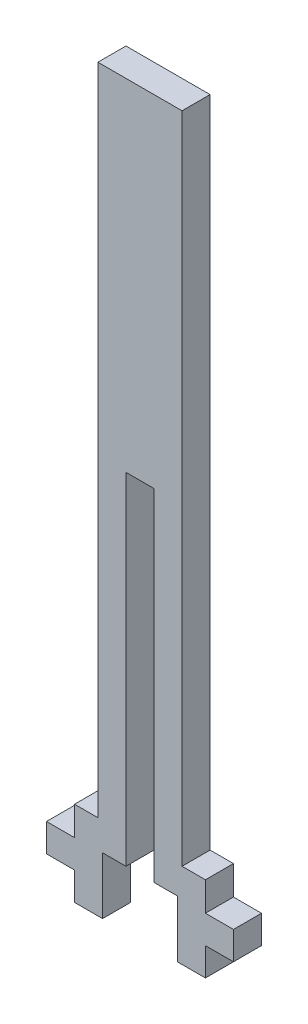
ISO-10303-21;
HEADER;
FILE_DESCRIPTION(('STEP AP214'),'2;1');
FILE_NAME('part.step','',(''),(''),'','','');
FILE_SCHEMA(('AUTOMOTIVE_DESIGN { 1 0 10303 214 1 1 1 1 }'));
ENDSEC;
DATA;
#1=APPLICATION_CONTEXT('core data for automotive mechanical design processes');
#2=APPLICATION_PROTOCOL_DEFINITION('international standard','automotive_design',2000,#1);
#3=PRODUCT_CONTEXT('',#1,'mechanical');
#4=PRODUCT('Part','Part','',(#3));
#5=PRODUCT_RELATED_PRODUCT_CATEGORY('part','',(#4));
#6=PRODUCT_DEFINITION_FORMATION('','',#4);
#7=PRODUCT_DEFINITION_CONTEXT('part definition',#1,'design');
#8=PRODUCT_DEFINITION('design','',#6,#7);
#9=PRODUCT_DEFINITION_SHAPE('','',#8);
#10=(LENGTH_UNIT() NAMED_UNIT(*) SI_UNIT(.MILLI.,.METRE.));
#11=(NAMED_UNIT(*) PLANE_ANGLE_UNIT() SI_UNIT($,.RADIAN.));
#12=(NAMED_UNIT(*) SI_UNIT($,.STERADIAN.) SOLID_ANGLE_UNIT());
#13=UNCERTAINTY_MEASURE_WITH_UNIT(LENGTH_MEASURE(1.E-05),#10,'distance_accuracy_value','');
#14=(GEOMETRIC_REPRESENTATION_CONTEXT(3) GLOBAL_UNCERTAINTY_ASSIGNED_CONTEXT((#13)) GLOBAL_UNIT_ASSIGNED_CONTEXT((#10,
#11,#12)) REPRESENTATION_CONTEXT('',''));
#15=CARTESIAN_POINT('',(0.,0.,0.));
#16=DIRECTION('',(0.,0.,1.));
#17=DIRECTION('',(1.,0.,0.));
#18=AXIS2_PLACEMENT_3D('',#15,#16,#17);
#19=CARTESIAN_POINT('',(7.,0.,3.));
#20=DIRECTION('',(-1.,0.,0.));
#21=DIRECTION('',(0.,0.,1.));
#22=AXIS2_PLACEMENT_3D('',#19,#20,#21);
#23=PLANE('',#22);
#24=DIRECTION('',(0.,0.,1.));
#25=VECTOR('',#24,1.);
#26=CARTESIAN_POINT('',(7.,-33.543999941,0.));
#27=LINE('',#26,#25);
#28=CARTESIAN_POINT('',(7.,-33.543999941,0.));
#29=VERTEX_POINT('',#28);
#30=CARTESIAN_POINT('',(7.,-33.543999941,3.));
#31=VERTEX_POINT('',#30);
#32=EDGE_CURVE('E211',#29,#31,#27,.T.);
#33=ORIENTED_EDGE('',*,*,#32,.F.);
#34=DIRECTION('',(0.,1.,0.));
#35=VECTOR('',#34,1.);
#36=CARTESIAN_POINT('',(7.,0.,0.));
#37=LINE('',#36,#35);
#38=CARTESIAN_POINT('',(7.,-30.443999941,0.));
#39=VERTEX_POINT('',#38);
#40=EDGE_CURVE('E306',#29,#39,#37,.T.);
#41=ORIENTED_EDGE('',*,*,#40,.T.);
#42=DIRECTION('',(0.,0.,-1.));
#43=VECTOR('',#42,1.);
#44=CARTESIAN_POINT('',(7.,-30.443999941,3.));
#45=LINE('',#44,#43);
#46=CARTESIAN_POINT('',(7.,-30.443999941,3.));
#47=VERTEX_POINT('',#46);
#48=EDGE_CURVE('E235',#47,#39,#45,.T.);
#49=ORIENTED_EDGE('',*,*,#48,.F.);
#50=DIRECTION('',(0.,1.,0.));
#51=VECTOR('',#50,1.);
#52=CARTESIAN_POINT('',(7.,0.,3.));
#53=LINE('',#52,#51);
#54=EDGE_CURVE('E227',#31,#47,#53,.T.);
#55=ORIENTED_EDGE('',*,*,#54,.F.);
#56=EDGE_LOOP('',(#33,#41,#49,#55));
#57=FACE_BOUND('',#56,.T.);
#58=ADVANCED_FACE('F50',(#57),#23,.F.);
#59=CARTESIAN_POINT('',(-7.,0.,3.));
#60=DIRECTION('',(1.,0.,0.));
#61=DIRECTION('',(0.,0.,-1.));
#62=AXIS2_PLACEMENT_3D('',#59,#60,#61);
#63=PLANE('',#62);
#64=DIRECTION('',(0.,0.,1.));
#65=VECTOR('',#64,1.);
#66=CARTESIAN_POINT('',(-7.,-36.543999941,0.));
#67=LINE('',#66,#65);
#68=CARTESIAN_POINT('',(-7.,-36.543999941,0.));
#69=VERTEX_POINT('',#68);
#70=CARTESIAN_POINT('',(-7.,-36.543999941,3.));
#71=VERTEX_POINT('',#70);
#72=EDGE_CURVE('E420',#69,#71,#67,.T.);
#73=ORIENTED_EDGE('',*,*,#72,.F.);
#74=DIRECTION('',(0.,-1.,0.));
#75=VECTOR('',#74,1.);
#76=CARTESIAN_POINT('',(-7.,0.,0.));
#77=LINE('',#76,#75);
#78=CARTESIAN_POINT('',(-7.,-39.543999941,0.));
#79=VERTEX_POINT('',#78);
#80=EDGE_CURVE('E283',#69,#79,#77,.T.);
#81=ORIENTED_EDGE('',*,*,#80,.T.);
#82=DIRECTION('',(0.,0.,-1.));
#83=VECTOR('',#82,1.);
#84=CARTESIAN_POINT('',(-7.,-39.543999941,3.));
#85=LINE('',#84,#83);
#86=CARTESIAN_POINT('',(-7.,-39.543999941,3.));
#87=VERTEX_POINT('',#86);
#88=EDGE_CURVE('E346',#87,#79,#85,.T.);
#89=ORIENTED_EDGE('',*,*,#88,.F.);
#90=DIRECTION('',(0.,-1.,0.));
#91=VECTOR('',#90,1.);
#92=CARTESIAN_POINT('',(-7.,0.,3.));
#93=LINE('',#92,#91);
#94=EDGE_CURVE('E877',#71,#87,#93,.T.);
#95=ORIENTED_EDGE('',*,*,#94,.F.);
#96=EDGE_LOOP('',(#73,#81,#89,#95));
#97=FACE_BOUND('',#96,.T.);
#98=ADVANCED_FACE('F544',(#97),#63,.F.);
#99=CARTESIAN_POINT('',(0.,-33.443999941,3.));
#100=DIRECTION('',(0.,1.,0.));
#101=DIRECTION('',(-1.,0.,0.));
#102=AXIS2_PLACEMENT_3D('',#99,#100,#101);
#103=PLANE('',#102);
#104=DIRECTION('',(1.,0.,0.));
#105=VECTOR('',#104,1.);
#106=CARTESIAN_POINT('',(0.,-33.443999941,3.));
#107=LINE('',#106,#105);
#108=CARTESIAN_POINT('',(1.5,-33.443999941,3.));
#109=VERTEX_POINT('',#108);
#110=CARTESIAN_POINT('',(4.,-33.443999941,3.));
#111=VERTEX_POINT('',#110);
#112=EDGE_CURVE('E500',#109,#111,#107,.T.);
#113=ORIENTED_EDGE('',*,*,#112,.F.);
#114=DIRECTION('',(0.,0.,-1.));
#115=VECTOR('',#114,1.);
#116=CARTESIAN_POINT('',(1.5,-33.443999941,39.6171002633156));
#117=LINE('',#116,#115);
#118=CARTESIAN_POINT('',(1.5,-33.443999941,0.));
#119=VERTEX_POINT('',#118);
#120=EDGE_CURVE('E396',#109,#119,#117,.T.);
#121=ORIENTED_EDGE('',*,*,#120,.T.);
#122=DIRECTION('',(1.,0.,0.));
#123=VECTOR('',#122,1.);
#124=CARTESIAN_POINT('',(0.,-33.443999941,0.));
#125=LINE('',#124,#123);
#126=CARTESIAN_POINT('',(4.,-33.443999941,0.));
#127=VERTEX_POINT('',#126);
#128=EDGE_CURVE('E294',#119,#127,#125,.T.);
#129=ORIENTED_EDGE('',*,*,#128,.T.);
#130=DIRECTION('',(0.,0.,-1.));
#131=VECTOR('',#130,1.);
#132=CARTESIAN_POINT('',(4.,-33.443999941,3.));
#133=LINE('',#132,#131);
#134=EDGE_CURVE('E334',#111,#127,#133,.T.);
#135=ORIENTED_EDGE('',*,*,#134,.F.);
#136=EDGE_LOOP('',(#113,#121,#129,#135));
#137=FACE_BOUND('',#136,.T.);
#138=ADVANCED_FACE('F521',(#137),#103,.F.);
#139=CARTESIAN_POINT('',(0.,39.543999941,3.));
#140=DIRECTION('',(0.,1.,0.));
#141=DIRECTION('',(0.,0.,1.));
#142=AXIS2_PLACEMENT_3D('',#139,#140,#141);
#143=PLANE('',#142);
#144=DIRECTION('',(1.,0.,0.));
#145=VECTOR('',#144,1.);
#146=CARTESIAN_POINT('',(0.,39.543999941,0.));
#147=LINE('',#146,#145);
#148=CARTESIAN_POINT('',(-4.5,39.543999941,0.));
#149=VERTEX_POINT('',#148);
#150=CARTESIAN_POINT('',(4.5,39.543999941,0.));
#151=VERTEX_POINT('',#150);
#152=EDGE_CURVE('E271',#149,#151,#147,.T.);
#153=ORIENTED_EDGE('',*,*,#152,.F.);
#154=DIRECTION('',(0.,0.,-1.));
#155=VECTOR('',#154,1.);
#156=CARTESIAN_POINT('',(-4.5,39.543999941,3.));
#157=LINE('',#156,#155);
#158=CARTESIAN_POINT('',(-4.5,39.543999941,3.));
#159=VERTEX_POINT('',#158);
#160=EDGE_CURVE('E12',#159,#149,#157,.T.);
#161=ORIENTED_EDGE('',*,*,#160,.F.);
#162=DIRECTION('',(1.,0.,0.));
#163=VECTOR('',#162,1.);
#164=CARTESIAN_POINT('',(0.,39.543999941,3.));
#165=LINE('',#164,#163);
#166=CARTESIAN_POINT('',(4.5,39.543999941,3.));
#167=VERTEX_POINT('',#166);
#168=EDGE_CURVE('E319',#159,#167,#165,.T.);
#169=ORIENTED_EDGE('',*,*,#168,.T.);
#170=DIRECTION('',(0.,0.,-1.));
#171=VECTOR('',#170,1.);
#172=CARTESIAN_POINT('',(4.5,39.543999941,3.));
#173=LINE('',#172,#171);
#174=EDGE_CURVE('E270',#167,#151,#173,.T.);
#175=ORIENTED_EDGE('',*,*,#174,.T.);
#176=EDGE_LOOP('',(#153,#161,#169,#175));
#177=FACE_BOUND('',#176,.T.);
#178=ADVANCED_FACE('F52',(#177),#143,.T.);
#179=CARTESIAN_POINT('',(-4.5,0.,3.));
#180=DIRECTION('',(-1.,0.,0.));
#181=DIRECTION('',(0.,0.,1.));
#182=AXIS2_PLACEMENT_3D('',#179,#180,#181);
#183=PLANE('',#182);
#184=DIRECTION('',(0.,1.,0.));
#185=VECTOR('',#184,1.);
#186=CARTESIAN_POINT('',(-4.5,0.,0.));
#187=LINE('',#186,#185);
#188=CARTESIAN_POINT('',(-4.5,-30.443999941,0.));
#189=VERTEX_POINT('',#188);
#190=EDGE_CURVE('E275',#189,#149,#187,.T.);
#191=ORIENTED_EDGE('',*,*,#190,.F.);
#192=DIRECTION('',(0.,0.,-1.));
#193=VECTOR('',#192,1.);
#194=CARTESIAN_POINT('',(-4.5,-30.443999941,3.));
#195=LINE('',#194,#193);
#196=CARTESIAN_POINT('',(-4.5,-30.443999941,3.));
#197=VERTEX_POINT('',#196);
#198=EDGE_CURVE('E59',#197,#189,#195,.T.);
#199=ORIENTED_EDGE('',*,*,#198,.F.);
#200=DIRECTION('',(0.,1.,0.));
#201=VECTOR('',#200,1.);
#202=CARTESIAN_POINT('',(-4.5,0.,3.));
#203=LINE('',#202,#201);
#204=EDGE_CURVE('E371',#197,#159,#203,.T.);
#205=ORIENTED_EDGE('',*,*,#204,.T.);
#206=ORIENTED_EDGE('',*,*,#160,.T.);
#207=EDGE_LOOP('',(#191,#199,#205,#206));
#208=FACE_BOUND('',#207,.T.);
#209=ADVANCED_FACE('F369',(#208),#183,.T.);
#210=CARTESIAN_POINT('',(0.,-30.443999941,3.));
#211=DIRECTION('',(0.,-1.,0.));
#212=DIRECTION('',(0.,0.,-1.));
#213=AXIS2_PLACEMENT_3D('',#210,#211,#212);
#214=PLANE('',#213);
#215=DIRECTION('',(-1.,0.,0.));
#216=VECTOR('',#215,1.);
#217=CARTESIAN_POINT('',(0.,-30.443999941,0.));
#218=LINE('',#217,#216);
#219=CARTESIAN_POINT('',(-7.,-30.443999941,0.));
#220=VERTEX_POINT('',#219);
#221=EDGE_CURVE('E280',#189,#220,#218,.T.);
#222=ORIENTED_EDGE('',*,*,#221,.T.);
#223=DIRECTION('',(0.,0.,-1.));
#224=VECTOR('',#223,1.);
#225=CARTESIAN_POINT('',(-7.,-30.443999941,3.));
#226=LINE('',#225,#224);
#227=CARTESIAN_POINT('',(-7.,-30.443999941,3.));
#228=VERTEX_POINT('',#227);
#229=EDGE_CURVE('E350',#228,#220,#226,.T.);
#230=ORIENTED_EDGE('',*,*,#229,.F.);
#231=DIRECTION('',(-1.,0.,0.));
#232=VECTOR('',#231,1.);
#233=CARTESIAN_POINT('',(0.,-30.443999941,3.));
#234=LINE('',#233,#232);
#235=EDGE_CURVE('E359',#197,#228,#234,.T.);
#236=ORIENTED_EDGE('',*,*,#235,.F.);
#237=ORIENTED_EDGE('',*,*,#198,.T.);
#238=EDGE_LOOP('',(#222,#230,#236,#237));
#239=FACE_BOUND('',#238,.T.);
#240=ADVANCED_FACE('F357',(#239),#214,.F.);
#241=CARTESIAN_POINT('',(-7.,-33.543999941,0.));
#242=VERTEX_POINT('',#241);
#243=EDGE_CURVE('E284',#220,#242,#77,.T.);
#244=ORIENTED_EDGE('',*,*,#243,.T.);
#245=DIRECTION('',(0.,0.,1.));
#246=VECTOR('',#245,1.);
#247=CARTESIAN_POINT('',(-7.,-33.543999941,0.));
#248=LINE('',#247,#246);
#249=CARTESIAN_POINT('',(-7.,-33.543999941,3.));
#250=VERTEX_POINT('',#249);
#251=EDGE_CURVE('E429',#242,#250,#248,.T.);
#252=ORIENTED_EDGE('',*,*,#251,.T.);
#253=EDGE_CURVE('E874',#228,#250,#93,.T.);
#254=ORIENTED_EDGE('',*,*,#253,.F.);
#255=ORIENTED_EDGE('',*,*,#229,.T.);
#256=EDGE_LOOP('',(#244,#252,#254,#255));
#257=FACE_BOUND('',#256,.T.);
#258=ADVANCED_FACE('F551',(#257),#63,.F.);
#259=CARTESIAN_POINT('',(0.,-39.543999941,3.));
#260=DIRECTION('',(0.,1.,0.));
#261=DIRECTION('',(0.,0.,1.));
#262=AXIS2_PLACEMENT_3D('',#259,#260,#261);
#263=PLANE('',#262);
#264=DIRECTION('',(1.,0.,0.));
#265=VECTOR('',#264,1.);
#266=CARTESIAN_POINT('',(0.,-39.543999941,0.));
#267=LINE('',#266,#265);
#268=CARTESIAN_POINT('',(-4.,-39.543999941,0.));
#269=VERTEX_POINT('',#268);
#270=EDGE_CURVE('E288',#79,#269,#267,.T.);
#271=ORIENTED_EDGE('',*,*,#270,.T.);
#272=DIRECTION('',(0.,0.,-1.));
#273=VECTOR('',#272,1.);
#274=CARTESIAN_POINT('',(-4.,-39.543999941,3.));
#275=LINE('',#274,#273);
#276=CARTESIAN_POINT('',(-4.,-39.543999941,3.));
#277=VERTEX_POINT('',#276);
#278=EDGE_CURVE('E342',#277,#269,#275,.T.);
#279=ORIENTED_EDGE('',*,*,#278,.F.);
#280=DIRECTION('',(1.,0.,0.));
#281=VECTOR('',#280,1.);
#282=CARTESIAN_POINT('',(0.,-39.543999941,3.));
#283=LINE('',#282,#281);
#284=EDGE_CURVE('E876',#87,#277,#283,.T.);
#285=ORIENTED_EDGE('',*,*,#284,.F.);
#286=ORIENTED_EDGE('',*,*,#88,.T.);
#287=EDGE_LOOP('',(#271,#279,#285,#286));
#288=FACE_BOUND('',#287,.T.);
#289=ADVANCED_FACE('F571',(#288),#263,.F.);
#290=CARTESIAN_POINT('',(-4.,0.,3.));
#291=DIRECTION('',(-1.,0.,0.));
#292=DIRECTION('',(0.,0.,1.));
#293=AXIS2_PLACEMENT_3D('',#290,#291,#292);
#294=PLANE('',#293);
#295=DIRECTION('',(0.,1.,0.));
#296=VECTOR('',#295,1.);
#297=CARTESIAN_POINT('',(-4.,0.,0.));
#298=LINE('',#297,#296);
#299=CARTESIAN_POINT('',(-4.,-33.443999941,0.));
#300=VERTEX_POINT('',#299);
#301=EDGE_CURVE('E291',#269,#300,#298,.T.);
#302=ORIENTED_EDGE('',*,*,#301,.T.);
#303=DIRECTION('',(0.,0.,-1.));
#304=VECTOR('',#303,1.);
#305=CARTESIAN_POINT('',(-4.,-33.443999941,3.));
#306=LINE('',#305,#304);
#307=CARTESIAN_POINT('',(-4.,-33.443999941,3.));
#308=VERTEX_POINT('',#307);
#309=EDGE_CURVE('E338',#308,#300,#306,.T.);
#310=ORIENTED_EDGE('',*,*,#309,.F.);
#311=DIRECTION('',(0.,1.,0.));
#312=VECTOR('',#311,1.);
#313=CARTESIAN_POINT('',(-4.,0.,3.));
#314=LINE('',#313,#312);
#315=EDGE_CURVE('E501',#277,#308,#314,.T.);
#316=ORIENTED_EDGE('',*,*,#315,.F.);
#317=ORIENTED_EDGE('',*,*,#278,.T.);
#318=EDGE_LOOP('',(#302,#310,#316,#317));
#319=FACE_BOUND('',#318,.T.);
#320=ADVANCED_FACE('F567',(#319),#294,.F.);
#321=CARTESIAN_POINT('',(-1.5,-33.443999941,0.));
#322=VERTEX_POINT('',#321);
#323=EDGE_CURVE('E295',#300,#322,#125,.T.);
#324=ORIENTED_EDGE('',*,*,#323,.T.);
#325=DIRECTION('',(0.,0.,-1.));
#326=VECTOR('',#325,1.);
#327=CARTESIAN_POINT('',(-1.5,-33.443999941,39.6171002633156));
#328=LINE('',#327,#326);
#329=CARTESIAN_POINT('',(-1.5,-33.443999941,3.));
#330=VERTEX_POINT('',#329);
#331=EDGE_CURVE('E393',#330,#322,#328,.T.);
#332=ORIENTED_EDGE('',*,*,#331,.F.);
#333=EDGE_CURVE('E496',#308,#330,#107,.T.);
#334=ORIENTED_EDGE('',*,*,#333,.F.);
#335=ORIENTED_EDGE('',*,*,#309,.T.);
#336=EDGE_LOOP('',(#324,#332,#334,#335));
#337=FACE_BOUND('',#336,.T.);
#338=ADVANCED_FACE('F562',(#337),#103,.F.);
#339=CARTESIAN_POINT('',(4.,0.,3.));
#340=DIRECTION('',(-1.,0.,0.));
#341=DIRECTION('',(0.,0.,1.));
#342=AXIS2_PLACEMENT_3D('',#339,#340,#341);
#343=PLANE('',#342);
#344=DIRECTION('',(0.,1.,0.));
#345=VECTOR('',#344,1.);
#346=CARTESIAN_POINT('',(4.,0.,0.));
#347=LINE('',#346,#345);
#348=CARTESIAN_POINT('',(4.,-39.543999941,0.));
#349=VERTEX_POINT('',#348);
#350=EDGE_CURVE('E299',#349,#127,#347,.T.);
#351=ORIENTED_EDGE('',*,*,#350,.F.);
#352=DIRECTION('',(0.,0.,-1.));
#353=VECTOR('',#352,1.);
#354=CARTESIAN_POINT('',(4.,-39.543999941,3.));
#355=LINE('',#354,#353);
#356=CARTESIAN_POINT('',(4.,-39.543999941,3.));
#357=VERTEX_POINT('',#356);
#358=EDGE_CURVE('E331',#357,#349,#355,.T.);
#359=ORIENTED_EDGE('',*,*,#358,.F.);
#360=DIRECTION('',(0.,1.,0.));
#361=VECTOR('',#360,1.);
#362=CARTESIAN_POINT('',(4.,0.,3.));
#363=LINE('',#362,#361);
#364=EDGE_CURVE('E245',#357,#111,#363,.T.);
#365=ORIENTED_EDGE('',*,*,#364,.T.);
#366=ORIENTED_EDGE('',*,*,#134,.T.);
#367=EDGE_LOOP('',(#351,#359,#365,#366));
#368=FACE_BOUND('',#367,.T.);
#369=ADVANCED_FACE('F514',(#368),#343,.T.);
#370=CARTESIAN_POINT('',(0.,-39.543999941,3.));
#371=DIRECTION('',(0.,1.,0.));
#372=DIRECTION('',(0.,0.,1.));
#373=AXIS2_PLACEMENT_3D('',#370,#371,#372);
#374=PLANE('',#373);
#375=DIRECTION('',(1.,0.,0.));
#376=VECTOR('',#375,1.);
#377=CARTESIAN_POINT('',(0.,-39.543999941,0.));
#378=LINE('',#377,#376);
#379=CARTESIAN_POINT('',(7.,-39.543999941,0.));
#380=VERTEX_POINT('',#379);
#381=EDGE_CURVE('E303',#349,#380,#378,.T.);
#382=ORIENTED_EDGE('',*,*,#381,.T.);
#383=DIRECTION('',(0.,0.,-1.));
#384=VECTOR('',#383,1.);
#385=CARTESIAN_POINT('',(7.,-39.543999941,3.));
#386=LINE('',#385,#384);
#387=CARTESIAN_POINT('',(7.,-39.543999941,3.));
#388=VERTEX_POINT('',#387);
#389=EDGE_CURVE('E327',#388,#380,#386,.T.);
#390=ORIENTED_EDGE('',*,*,#389,.F.);
#391=DIRECTION('',(1.,0.,0.));
#392=VECTOR('',#391,1.);
#393=CARTESIAN_POINT('',(0.,-39.543999941,3.));
#394=LINE('',#393,#392);
#395=EDGE_CURVE('E239',#357,#388,#394,.T.);
#396=ORIENTED_EDGE('',*,*,#395,.F.);
#397=ORIENTED_EDGE('',*,*,#358,.T.);
#398=EDGE_LOOP('',(#382,#390,#396,#397));
#399=FACE_BOUND('',#398,.T.);
#400=ADVANCED_FACE('F528',(#399),#374,.F.);
#401=CARTESIAN_POINT('',(7.,-36.543999941,0.));
#402=VERTEX_POINT('',#401);
#403=EDGE_CURVE('E307',#380,#402,#37,.T.);
#404=ORIENTED_EDGE('',*,*,#403,.T.);
#405=DIRECTION('',(0.,0.,1.));
#406=VECTOR('',#405,1.);
#407=CARTESIAN_POINT('',(7.,-36.543999941,0.));
#408=LINE('',#407,#406);
#409=CARTESIAN_POINT('',(7.,-36.543999941,3.));
#410=VERTEX_POINT('',#409);
#411=EDGE_CURVE('E466',#402,#410,#408,.T.);
#412=ORIENTED_EDGE('',*,*,#411,.T.);
#413=EDGE_CURVE('E238',#388,#410,#53,.T.);
#414=ORIENTED_EDGE('',*,*,#413,.F.);
#415=ORIENTED_EDGE('',*,*,#389,.T.);
#416=EDGE_LOOP('',(#404,#412,#414,#415));
#417=FACE_BOUND('',#416,.T.);
#418=ADVANCED_FACE('F531',(#417),#23,.F.);
#419=CARTESIAN_POINT('',(0.,-30.443999941,3.));
#420=DIRECTION('',(0.,-1.,0.));
#421=DIRECTION('',(0.,0.,-1.));
#422=AXIS2_PLACEMENT_3D('',#419,#420,#421);
#423=PLANE('',#422);
#424=DIRECTION('',(-1.,0.,0.));
#425=VECTOR('',#424,1.);
#426=CARTESIAN_POINT('',(0.,-30.443999941,0.));
#427=LINE('',#426,#425);
#428=CARTESIAN_POINT('',(4.5,-30.443999941,0.));
#429=VERTEX_POINT('',#428);
#430=EDGE_CURVE('E311',#39,#429,#427,.T.);
#431=ORIENTED_EDGE('',*,*,#430,.T.);
#432=DIRECTION('',(0.,0.,-1.));
#433=VECTOR('',#432,1.);
#434=CARTESIAN_POINT('',(4.5,-30.443999941,3.));
#435=LINE('',#434,#433);
#436=CARTESIAN_POINT('',(4.5,-30.443999941,3.));
#437=VERTEX_POINT('',#436);
#438=EDGE_CURVE('E322',#437,#429,#435,.T.);
#439=ORIENTED_EDGE('',*,*,#438,.F.);
#440=DIRECTION('',(-1.,0.,0.));
#441=VECTOR('',#440,1.);
#442=CARTESIAN_POINT('',(0.,-30.443999941,3.));
#443=LINE('',#442,#441);
#444=EDGE_CURVE('E244',#47,#437,#443,.T.);
#445=ORIENTED_EDGE('',*,*,#444,.F.);
#446=ORIENTED_EDGE('',*,*,#48,.T.);
#447=EDGE_LOOP('',(#431,#439,#445,#446));
#448=FACE_BOUND('',#447,.T.);
#449=ADVANCED_FACE('F382',(#448),#423,.F.);
#450=CARTESIAN_POINT('',(4.5,0.,3.));
#451=DIRECTION('',(1.,0.,0.));
#452=DIRECTION('',(0.,0.,-1.));
#453=AXIS2_PLACEMENT_3D('',#450,#451,#452);
#454=PLANE('',#453);
#455=DIRECTION('',(0.,-1.,0.));
#456=VECTOR('',#455,1.);
#457=CARTESIAN_POINT('',(4.5,0.,0.));
#458=LINE('',#457,#456);
#459=EDGE_CURVE('E315',#151,#429,#458,.T.);
#460=ORIENTED_EDGE('',*,*,#459,.F.);
#461=ORIENTED_EDGE('',*,*,#174,.F.);
#462=DIRECTION('',(0.,-1.,0.));
#463=VECTOR('',#462,1.);
#464=CARTESIAN_POINT('',(4.5,0.,3.));
#465=LINE('',#464,#463);
#466=EDGE_CURVE('E265',#167,#437,#465,.T.);
#467=ORIENTED_EDGE('',*,*,#466,.T.);
#468=ORIENTED_EDGE('',*,*,#438,.T.);
#469=EDGE_LOOP('',(#460,#461,#467,#468));
#470=FACE_BOUND('',#469,.T.);
#471=ADVANCED_FACE('F378',(#470),#454,.T.);
#472=CARTESIAN_POINT('',(0.,0.,3.));
#473=DIRECTION('',(0.,0.,1.));
#474=DIRECTION('',(1.,0.,0.));
#475=AXIS2_PLACEMENT_3D('',#472,#473,#474);
#476=PLANE('',#475);
#477=DIRECTION('',(0.,-1.,0.));
#478=VECTOR('',#477,1.);
#479=CARTESIAN_POINT('',(1.5,-33.443999941,3.));
#480=LINE('',#479,#478);
#481=CARTESIAN_POINT('',(1.49999999999999,3.05,3.));
#482=VERTEX_POINT('',#481);
#483=EDGE_CURVE('E400',#482,#109,#480,.T.);
#484=ORIENTED_EDGE('',*,*,#483,.T.);
#485=ORIENTED_EDGE('',*,*,#112,.T.);
#486=ORIENTED_EDGE('',*,*,#364,.F.);
#487=ORIENTED_EDGE('',*,*,#395,.T.);
#488=ORIENTED_EDGE('',*,*,#413,.T.);
#489=DIRECTION('',(1.,0.,0.));
#490=VECTOR('',#489,1.);
#491=CARTESIAN_POINT('',(7.,-36.543999941,3.));
#492=LINE('',#491,#490);
#493=CARTESIAN_POINT('',(10.,-36.543999941,3.));
#494=VERTEX_POINT('',#493);
#495=EDGE_CURVE('E66',#410,#494,#492,.T.);
#496=ORIENTED_EDGE('',*,*,#495,.T.);
#497=DIRECTION('',(0.,1.,0.));
#498=VECTOR('',#497,1.);
#499=CARTESIAN_POINT('',(10.,-33.543999941,3.));
#500=LINE('',#499,#498);
#501=CARTESIAN_POINT('',(10.,-33.543999941,3.));
#502=VERTEX_POINT('',#501);
#503=EDGE_CURVE('E230',#494,#502,#500,.T.);
#504=ORIENTED_EDGE('',*,*,#503,.T.);
#505=DIRECTION('',(-1.,0.,0.));
#506=VECTOR('',#505,1.);
#507=CARTESIAN_POINT('',(7.,-33.543999941,3.));
#508=LINE('',#507,#506);
#509=EDGE_CURVE('E214',#502,#31,#508,.T.);
#510=ORIENTED_EDGE('',*,*,#509,.T.);
#511=ORIENTED_EDGE('',*,*,#54,.T.);
#512=ORIENTED_EDGE('',*,*,#444,.T.);
#513=ORIENTED_EDGE('',*,*,#466,.F.);
#514=ORIENTED_EDGE('',*,*,#168,.F.);
#515=ORIENTED_EDGE('',*,*,#204,.F.);
#516=ORIENTED_EDGE('',*,*,#235,.T.);
#517=ORIENTED_EDGE('',*,*,#253,.T.);
#518=DIRECTION('',(-1.,0.,0.));
#519=VECTOR('',#518,1.);
#520=CARTESIAN_POINT('',(-7.,-33.543999941,3.));
#521=LINE('',#520,#519);
#522=CARTESIAN_POINT('',(-10.,-33.543999941,3.));
#523=VERTEX_POINT('',#522);
#524=EDGE_CURVE('E74',#250,#523,#521,.T.);
#525=ORIENTED_EDGE('',*,*,#524,.T.);
#526=DIRECTION('',(0.,-1.,0.));
#527=VECTOR('',#526,1.);
#528=CARTESIAN_POINT('',(-10.,-33.543999941,3.));
#529=LINE('',#528,#527);
#530=CARTESIAN_POINT('',(-10.,-36.543999941,3.));
#531=VERTEX_POINT('',#530);
#532=EDGE_CURVE('E447',#523,#531,#529,.T.);
#533=ORIENTED_EDGE('',*,*,#532,.T.);
#534=DIRECTION('',(1.,0.,0.));
#535=VECTOR('',#534,1.);
#536=CARTESIAN_POINT('',(-7.,-36.543999941,3.));
#537=LINE('',#536,#535);
#538=EDGE_CURVE('E443',#531,#71,#537,.T.);
#539=ORIENTED_EDGE('',*,*,#538,.T.);
#540=ORIENTED_EDGE('',*,*,#94,.T.);
#541=ORIENTED_EDGE('',*,*,#284,.T.);
#542=ORIENTED_EDGE('',*,*,#315,.T.);
#543=ORIENTED_EDGE('',*,*,#333,.T.);
#544=DIRECTION('',(0.,1.,0.));
#545=VECTOR('',#544,1.);
#546=CARTESIAN_POINT('',(-1.5,-33.443999941,3.));
#547=LINE('',#546,#545);
#548=CARTESIAN_POINT('',(-1.50000000000001,3.05,3.));
#549=VERTEX_POINT('',#548);
#550=EDGE_CURVE('E389',#330,#549,#547,.T.);
#551=ORIENTED_EDGE('',*,*,#550,.T.);
#552=DIRECTION('',(1.,0.,0.));
#553=VECTOR('',#552,1.);
#554=CARTESIAN_POINT('',(1.49999999999999,3.05,3.));
#555=LINE('',#554,#553);
#556=EDGE_CURVE('E406',#549,#482,#555,.T.);
#557=ORIENTED_EDGE('',*,*,#556,.T.);
#558=EDGE_LOOP('',(#484,#485,#486,#487,#488,#496,#504,#510,#511,#512,#513,#514,#515,#516,#517,
#525,#533,#539,#540,#541,#542,#543,#551,#557));
#559=FACE_BOUND('',#558,.T.);
#560=ADVANCED_FACE('F226',(#559),#476,.T.);
#561=CARTESIAN_POINT('',(0.,0.,0.));
#562=DIRECTION('',(0.,0.,1.));
#563=DIRECTION('',(1.,0.,0.));
#564=AXIS2_PLACEMENT_3D('',#561,#562,#563);
#565=PLANE('',#564);
#566=ORIENTED_EDGE('',*,*,#128,.F.);
#567=DIRECTION('',(0.,-1.,0.));
#568=VECTOR('',#567,1.);
#569=CARTESIAN_POINT('',(1.5,-33.443999941,0.));
#570=LINE('',#569,#568);
#571=CARTESIAN_POINT('',(1.49999999999999,3.05,0.));
#572=VERTEX_POINT('',#571);
#573=EDGE_CURVE('E410',#572,#119,#570,.T.);
#574=ORIENTED_EDGE('',*,*,#573,.F.);
#575=DIRECTION('',(1.,0.,0.));
#576=VECTOR('',#575,1.);
#577=CARTESIAN_POINT('',(1.49999999999999,3.05,0.));
#578=LINE('',#577,#576);
#579=CARTESIAN_POINT('',(-1.50000000000001,3.05,0.));
#580=VERTEX_POINT('',#579);
#581=EDGE_CURVE('E412',#580,#572,#578,.T.);
#582=ORIENTED_EDGE('',*,*,#581,.F.);
#583=DIRECTION('',(0.,1.,0.));
#584=VECTOR('',#583,1.);
#585=CARTESIAN_POINT('',(-1.5,-33.443999941,0.));
#586=LINE('',#585,#584);
#587=EDGE_CURVE('E416',#322,#580,#586,.T.);
#588=ORIENTED_EDGE('',*,*,#587,.F.);
#589=ORIENTED_EDGE('',*,*,#323,.F.);
#590=ORIENTED_EDGE('',*,*,#301,.F.);
#591=ORIENTED_EDGE('',*,*,#270,.F.);
#592=ORIENTED_EDGE('',*,*,#80,.F.);
#593=DIRECTION('',(1.,0.,0.));
#594=VECTOR('',#593,1.);
#595=CARTESIAN_POINT('',(-7.,-36.543999941,0.));
#596=LINE('',#595,#594);
#597=CARTESIAN_POINT('',(-10.,-36.543999941,0.));
#598=VERTEX_POINT('',#597);
#599=EDGE_CURVE('E432',#598,#69,#596,.T.);
#600=ORIENTED_EDGE('',*,*,#599,.F.);
#601=DIRECTION('',(0.,-1.,0.));
#602=VECTOR('',#601,1.);
#603=CARTESIAN_POINT('',(-10.,-33.543999941,0.));
#604=LINE('',#603,#602);
#605=CARTESIAN_POINT('',(-10.,-33.543999941,0.));
#606=VERTEX_POINT('',#605);
#607=EDGE_CURVE('E435',#606,#598,#604,.T.);
#608=ORIENTED_EDGE('',*,*,#607,.F.);
#609=DIRECTION('',(-1.,0.,0.));
#610=VECTOR('',#609,1.);
#611=CARTESIAN_POINT('',(-7.,-33.543999941,0.));
#612=LINE('',#611,#610);
#613=EDGE_CURVE('E439',#242,#606,#612,.T.);
#614=ORIENTED_EDGE('',*,*,#613,.F.);
#615=ORIENTED_EDGE('',*,*,#243,.F.);
#616=ORIENTED_EDGE('',*,*,#221,.F.);
#617=ORIENTED_EDGE('',*,*,#190,.T.);
#618=ORIENTED_EDGE('',*,*,#152,.T.);
#619=ORIENTED_EDGE('',*,*,#459,.T.);
#620=ORIENTED_EDGE('',*,*,#430,.F.);
#621=ORIENTED_EDGE('',*,*,#40,.F.);
#622=DIRECTION('',(-1.,0.,0.));
#623=VECTOR('',#622,1.);
#624=CARTESIAN_POINT('',(7.,-33.543999941,0.));
#625=LINE('',#624,#623);
#626=CARTESIAN_POINT('',(10.,-33.543999941,0.));
#627=VERTEX_POINT('',#626);
#628=EDGE_CURVE('E216',#627,#29,#625,.T.);
#629=ORIENTED_EDGE('',*,*,#628,.F.);
#630=DIRECTION('',(0.,1.,0.));
#631=VECTOR('',#630,1.);
#632=CARTESIAN_POINT('',(10.,-33.543999941,0.));
#633=LINE('',#632,#631);
#634=CARTESIAN_POINT('',(10.,-36.543999941,0.));
#635=VERTEX_POINT('',#634);
#636=EDGE_CURVE('E460',#635,#627,#633,.T.);
#637=ORIENTED_EDGE('',*,*,#636,.F.);
#638=DIRECTION('',(1.,0.,0.));
#639=VECTOR('',#638,1.);
#640=CARTESIAN_POINT('',(7.,-36.543999941,0.));
#641=LINE('',#640,#639);
#642=EDGE_CURVE('E232',#402,#635,#641,.T.);
#643=ORIENTED_EDGE('',*,*,#642,.F.);
#644=ORIENTED_EDGE('',*,*,#403,.F.);
#645=ORIENTED_EDGE('',*,*,#381,.F.);
#646=ORIENTED_EDGE('',*,*,#350,.T.);
#647=EDGE_LOOP('',(#566,#574,#582,#588,#589,#590,#591,#592,#600,#608,#614,#615,#616,#617,#618,
#619,#620,#621,#629,#637,#643,#644,#645,#646));
#648=FACE_BOUND('',#647,.T.);
#649=ADVANCED_FACE('F367',(#648),#565,.F.);
#650=CARTESIAN_POINT('',(1.49999999999999,3.05,39.6171002633156));
#651=DIRECTION('',(0.,1.,0.));
#652=DIRECTION('',(0.,0.,1.));
#653=AXIS2_PLACEMENT_3D('',#650,#651,#652);
#654=PLANE('',#653);
#655=DIRECTION('',(0.,0.,-1.));
#656=VECTOR('',#655,1.);
#657=CARTESIAN_POINT('',(-1.50000000000001,3.05,39.6171002633156));
#658=LINE('',#657,#656);
#659=EDGE_CURVE('E276',#549,#580,#658,.T.);
#660=ORIENTED_EDGE('',*,*,#659,.T.);
#661=ORIENTED_EDGE('',*,*,#581,.T.);
#662=DIRECTION('',(0.,0.,-1.));
#663=VECTOR('',#662,1.);
#664=CARTESIAN_POINT('',(1.49999999999999,3.05,39.6171002633156));
#665=LINE('',#664,#663);
#666=EDGE_CURVE('E403',#482,#572,#665,.T.);
#667=ORIENTED_EDGE('',*,*,#666,.F.);
#668=ORIENTED_EDGE('',*,*,#556,.F.);
#669=EDGE_LOOP('',(#660,#661,#667,#668));
#670=FACE_BOUND('',#669,.T.);
#671=ADVANCED_FACE('F627',(#670),#654,.F.);
#672=CARTESIAN_POINT('',(1.5,-33.443999941,39.6171002633156));
#673=DIRECTION('',(1.,0.,0.));
#674=DIRECTION('',(0.,1.,0.));
#675=AXIS2_PLACEMENT_3D('',#672,#673,#674);
#676=PLANE('',#675);
#677=ORIENTED_EDGE('',*,*,#666,.T.);
#678=ORIENTED_EDGE('',*,*,#573,.T.);
#679=ORIENTED_EDGE('',*,*,#120,.F.);
#680=ORIENTED_EDGE('',*,*,#483,.F.);
#681=EDGE_LOOP('',(#677,#678,#679,#680));
#682=FACE_BOUND('',#681,.T.);
#683=ADVANCED_FACE('F613',(#682),#676,.F.);
#684=CARTESIAN_POINT('',(-1.5,-33.443999941,39.6171002633156));
#685=DIRECTION('',(-1.,0.,0.));
#686=DIRECTION('',(0.,-1.,0.));
#687=AXIS2_PLACEMENT_3D('',#684,#685,#686);
#688=PLANE('',#687);
#689=ORIENTED_EDGE('',*,*,#331,.T.);
#690=ORIENTED_EDGE('',*,*,#587,.T.);
#691=ORIENTED_EDGE('',*,*,#659,.F.);
#692=ORIENTED_EDGE('',*,*,#550,.F.);
#693=EDGE_LOOP('',(#689,#690,#691,#692));
#694=FACE_BOUND('',#693,.T.);
#695=ADVANCED_FACE('F606',(#694),#688,.F.);
#696=CARTESIAN_POINT('',(-7.,-36.543999941,0.));
#697=DIRECTION('',(0.,-1.,0.));
#698=DIRECTION('',(0.,0.,-1.));
#699=AXIS2_PLACEMENT_3D('',#696,#697,#698);
#700=PLANE('',#699);
#701=ORIENTED_EDGE('',*,*,#538,.F.);
#702=DIRECTION('',(0.,0.,1.));
#703=VECTOR('',#702,1.);
#704=CARTESIAN_POINT('',(-10.,-36.543999941,0.));
#705=LINE('',#704,#703);
#706=EDGE_CURVE('E423',#598,#531,#705,.T.);
#707=ORIENTED_EDGE('',*,*,#706,.F.);
#708=ORIENTED_EDGE('',*,*,#599,.T.);
#709=ORIENTED_EDGE('',*,*,#72,.T.);
#710=EDGE_LOOP('',(#701,#707,#708,#709));
#711=FACE_BOUND('',#710,.T.);
#712=ADVANCED_FACE('F612',(#711),#700,.T.);
#713=CARTESIAN_POINT('',(-10.,-33.543999941,0.));
#714=DIRECTION('',(-1.,0.,0.));
#715=DIRECTION('',(0.,-1.,0.));
#716=AXIS2_PLACEMENT_3D('',#713,#714,#715);
#717=PLANE('',#716);
#718=ORIENTED_EDGE('',*,*,#532,.F.);
#719=DIRECTION('',(0.,0.,1.));
#720=VECTOR('',#719,1.);
#721=CARTESIAN_POINT('',(-10.,-33.543999941,0.));
#722=LINE('',#721,#720);
#723=EDGE_CURVE('E426',#606,#523,#722,.T.);
#724=ORIENTED_EDGE('',*,*,#723,.F.);
#725=ORIENTED_EDGE('',*,*,#607,.T.);
#726=ORIENTED_EDGE('',*,*,#706,.T.);
#727=EDGE_LOOP('',(#718,#724,#725,#726));
#728=FACE_BOUND('',#727,.T.);
#729=ADVANCED_FACE('F791',(#728),#717,.T.);
#730=CARTESIAN_POINT('',(-7.,-33.543999941,0.));
#731=DIRECTION('',(0.,1.,0.));
#732=DIRECTION('',(0.,0.,1.));
#733=AXIS2_PLACEMENT_3D('',#730,#731,#732);
#734=PLANE('',#733);
#735=ORIENTED_EDGE('',*,*,#524,.F.);
#736=ORIENTED_EDGE('',*,*,#251,.F.);
#737=ORIENTED_EDGE('',*,*,#613,.T.);
#738=ORIENTED_EDGE('',*,*,#723,.T.);
#739=EDGE_LOOP('',(#735,#736,#737,#738));
#740=FACE_BOUND('',#739,.T.);
#741=ADVANCED_FACE('F541',(#740),#734,.T.);
#742=CARTESIAN_POINT('',(7.,-33.543999941,0.));
#743=DIRECTION('',(0.,1.,0.));
#744=DIRECTION('',(0.,0.,1.));
#745=AXIS2_PLACEMENT_3D('',#742,#743,#744);
#746=PLANE('',#745);
#747=ORIENTED_EDGE('',*,*,#509,.F.);
#748=DIRECTION('',(0.,0.,1.));
#749=VECTOR('',#748,1.);
#750=CARTESIAN_POINT('',(10.,-33.543999941,0.));
#751=LINE('',#750,#749);
#752=EDGE_CURVE('E221',#627,#502,#751,.T.);
#753=ORIENTED_EDGE('',*,*,#752,.F.);
#754=ORIENTED_EDGE('',*,*,#628,.T.);
#755=ORIENTED_EDGE('',*,*,#32,.T.);
#756=EDGE_LOOP('',(#747,#753,#754,#755));
#757=FACE_BOUND('',#756,.T.);
#758=ADVANCED_FACE('F213',(#757),#746,.T.);
#759=CARTESIAN_POINT('',(10.,-33.543999941,0.));
#760=DIRECTION('',(1.,0.,0.));
#761=DIRECTION('',(0.,1.,0.));
#762=AXIS2_PLACEMENT_3D('',#759,#760,#761);
#763=PLANE('',#762);
#764=ORIENTED_EDGE('',*,*,#503,.F.);
#765=DIRECTION('',(0.,0.,1.));
#766=VECTOR('',#765,1.);
#767=CARTESIAN_POINT('',(10.,-36.543999941,0.));
#768=LINE('',#767,#766);
#769=EDGE_CURVE('E469',#635,#494,#768,.T.);
#770=ORIENTED_EDGE('',*,*,#769,.F.);
#771=ORIENTED_EDGE('',*,*,#636,.T.);
#772=ORIENTED_EDGE('',*,*,#752,.T.);
#773=EDGE_LOOP('',(#764,#770,#771,#772));
#774=FACE_BOUND('',#773,.T.);
#775=ADVANCED_FACE('F533',(#774),#763,.T.);
#776=CARTESIAN_POINT('',(7.,-36.543999941,0.));
#777=DIRECTION('',(0.,-1.,0.));
#778=DIRECTION('',(0.,0.,-1.));
#779=AXIS2_PLACEMENT_3D('',#776,#777,#778);
#780=PLANE('',#779);
#781=ORIENTED_EDGE('',*,*,#495,.F.);
#782=ORIENTED_EDGE('',*,*,#411,.F.);
#783=ORIENTED_EDGE('',*,*,#642,.T.);
#784=ORIENTED_EDGE('',*,*,#769,.T.);
#785=EDGE_LOOP('',(#781,#782,#783,#784));
#786=FACE_BOUND('',#785,.T.);
#787=ADVANCED_FACE('F532',(#786),#780,.T.);
#788=CLOSED_SHELL('',(#58,#98,#138,#178,#209,#240,#258,#289,#320,#338,#369,#400,#418,#449,#471,
#560,#649,#671,#683,#695,#712,#729,#741,#758,#775,#787));
#789=MANIFOLD_SOLID_BREP('B2',#788);
#790=ADVANCED_BREP_SHAPE_REPRESENTATION('',(#18,#789),#14);
#791=SHAPE_DEFINITION_REPRESENTATION(#9,#790);
ENDSEC;
END-ISO-10303-21;
